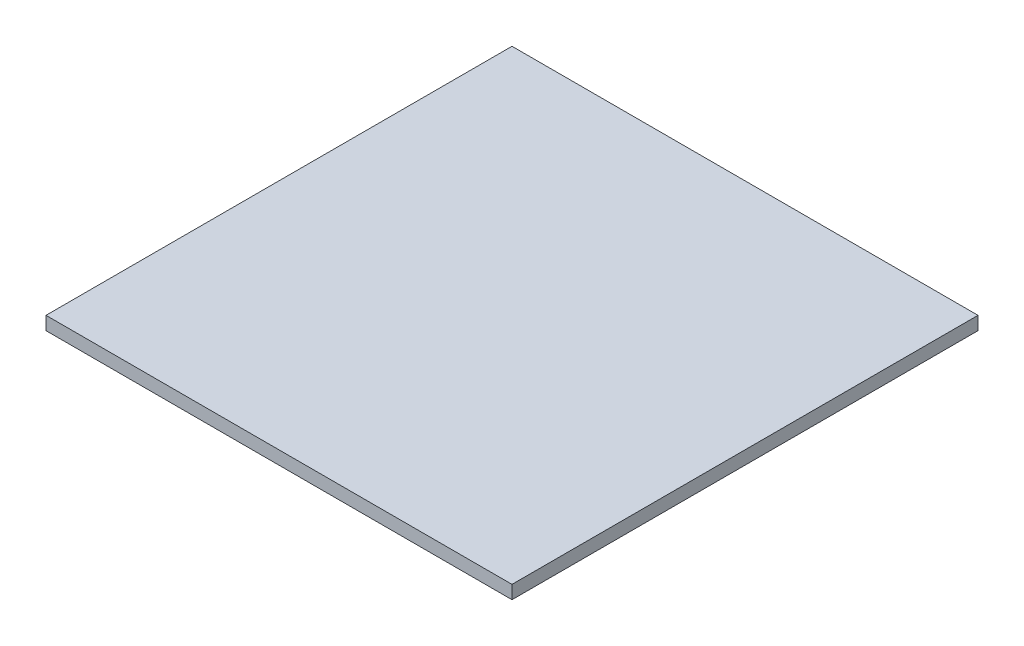
ISO-10303-21;
HEADER;
FILE_DESCRIPTION(('STEP AP214'),'2;1');
FILE_NAME('part.step','',(''),(''),'','','');
FILE_SCHEMA(('AUTOMOTIVE_DESIGN { 1 0 10303 214 1 1 1 1 }'));
ENDSEC;
DATA;
#1=APPLICATION_CONTEXT('core data for automotive mechanical design processes');
#2=APPLICATION_PROTOCOL_DEFINITION('international standard','automotive_design',2000,#1);
#3=PRODUCT_CONTEXT('',#1,'mechanical');
#4=PRODUCT('Part','Part','',(#3));
#5=PRODUCT_RELATED_PRODUCT_CATEGORY('part','',(#4));
#6=PRODUCT_DEFINITION_FORMATION('','',#4);
#7=PRODUCT_DEFINITION_CONTEXT('part definition',#1,'design');
#8=PRODUCT_DEFINITION('design','',#6,#7);
#9=PRODUCT_DEFINITION_SHAPE('','',#8);
#10=(LENGTH_UNIT() NAMED_UNIT(*) SI_UNIT(.MILLI.,.METRE.));
#11=(NAMED_UNIT(*) PLANE_ANGLE_UNIT() SI_UNIT($,.RADIAN.));
#12=(NAMED_UNIT(*) SI_UNIT($,.STERADIAN.) SOLID_ANGLE_UNIT());
#13=UNCERTAINTY_MEASURE_WITH_UNIT(LENGTH_MEASURE(1.E-05),#10,'distance_accuracy_value','');
#14=(GEOMETRIC_REPRESENTATION_CONTEXT(3) GLOBAL_UNCERTAINTY_ASSIGNED_CONTEXT((#13)) GLOBAL_UNIT_ASSIGNED_CONTEXT((#10,
#11,#12)) REPRESENTATION_CONTEXT('',''));
#15=CARTESIAN_POINT('',(0.,0.,0.));
#16=DIRECTION('',(0.,0.,1.));
#17=DIRECTION('',(1.,0.,0.));
#18=AXIS2_PLACEMENT_3D('',#15,#16,#17);
#19=CARTESIAN_POINT('',(52.5,3.,-52.5));
#20=DIRECTION('',(-1.,0.,0.));
#21=DIRECTION('',(0.,0.,1.));
#22=AXIS2_PLACEMENT_3D('',#19,#20,#21);
#23=PLANE('',#22);
#24=DIRECTION('',(0.,0.,-1.));
#25=VECTOR('',#24,1.);
#26=CARTESIAN_POINT('',(52.5,0.,-52.5));
#27=LINE('',#26,#25);
#28=CARTESIAN_POINT('',(52.5,0.,52.5));
#29=VERTEX_POINT('',#28);
#30=CARTESIAN_POINT('',(52.5,0.,-52.5));
#31=VERTEX_POINT('',#30);
#32=EDGE_CURVE('E102',#29,#31,#27,.T.);
#33=ORIENTED_EDGE('',*,*,#32,.T.);
#34=DIRECTION('',(0.,-1.,0.));
#35=VECTOR('',#34,1.);
#36=CARTESIAN_POINT('',(52.5,3.,-52.5));
#37=LINE('',#36,#35);
#38=CARTESIAN_POINT('',(52.5,3.,-52.5));
#39=VERTEX_POINT('',#38);
#40=EDGE_CURVE('E11',#39,#31,#37,.T.);
#41=ORIENTED_EDGE('',*,*,#40,.F.);
#42=DIRECTION('',(0.,0.,-1.));
#43=VECTOR('',#42,1.);
#44=CARTESIAN_POINT('',(52.5,3.,-52.5));
#45=LINE('',#44,#43);
#46=CARTESIAN_POINT('',(52.5,3.,52.5));
#47=VERTEX_POINT('',#46);
#48=EDGE_CURVE('E90',#47,#39,#45,.T.);
#49=ORIENTED_EDGE('',*,*,#48,.F.);
#50=DIRECTION('',(0.,-1.,0.));
#51=VECTOR('',#50,1.);
#52=CARTESIAN_POINT('',(52.5,3.,52.5));
#53=LINE('',#52,#51);
#54=EDGE_CURVE('E98',#47,#29,#53,.T.);
#55=ORIENTED_EDGE('',*,*,#54,.T.);
#56=EDGE_LOOP('',(#33,#41,#49,#55));
#57=FACE_BOUND('',#56,.T.);
#58=ADVANCED_FACE('F39',(#57),#23,.F.);
#59=CARTESIAN_POINT('',(-52.5,3.,-52.5));
#60=DIRECTION('',(0.,0.,1.));
#61=DIRECTION('',(1.,0.,0.));
#62=AXIS2_PLACEMENT_3D('',#59,#60,#61);
#63=PLANE('',#62);
#64=DIRECTION('',(-1.,0.,0.));
#65=VECTOR('',#64,1.);
#66=CARTESIAN_POINT('',(-52.5,0.,-52.5));
#67=LINE('',#66,#65);
#68=CARTESIAN_POINT('',(-52.5,0.,-52.5));
#69=VERTEX_POINT('',#68);
#70=EDGE_CURVE('E94',#31,#69,#67,.T.);
#71=ORIENTED_EDGE('',*,*,#70,.T.);
#72=DIRECTION('',(0.,-1.,0.));
#73=VECTOR('',#72,1.);
#74=CARTESIAN_POINT('',(-52.5,3.,-52.5));
#75=LINE('',#74,#73);
#76=CARTESIAN_POINT('',(-52.5,3.,-52.5));
#77=VERTEX_POINT('',#76);
#78=EDGE_CURVE('E47',#77,#69,#75,.T.);
#79=ORIENTED_EDGE('',*,*,#78,.F.);
#80=DIRECTION('',(-1.,0.,0.));
#81=VECTOR('',#80,1.);
#82=CARTESIAN_POINT('',(-52.5,3.,-52.5));
#83=LINE('',#82,#81);
#84=EDGE_CURVE('E85',#39,#77,#83,.T.);
#85=ORIENTED_EDGE('',*,*,#84,.F.);
#86=ORIENTED_EDGE('',*,*,#40,.T.);
#87=EDGE_LOOP('',(#71,#79,#85,#86));
#88=FACE_BOUND('',#87,.T.);
#89=ADVANCED_FACE('F93',(#88),#63,.F.);
#90=CARTESIAN_POINT('',(-52.5,3.,-52.5));
#91=DIRECTION('',(1.,0.,0.));
#92=DIRECTION('',(0.,0.,-1.));
#93=AXIS2_PLACEMENT_3D('',#90,#91,#92);
#94=PLANE('',#93);
#95=DIRECTION('',(0.,0.,1.));
#96=VECTOR('',#95,1.);
#97=CARTESIAN_POINT('',(-52.5,0.,-52.5));
#98=LINE('',#97,#96);
#99=CARTESIAN_POINT('',(-52.5,0.,52.5));
#100=VERTEX_POINT('',#99);
#101=EDGE_CURVE('E72',#69,#100,#98,.T.);
#102=ORIENTED_EDGE('',*,*,#101,.T.);
#103=DIRECTION('',(0.,-1.,0.));
#104=VECTOR('',#103,1.);
#105=CARTESIAN_POINT('',(-52.5,3.,52.5));
#106=LINE('',#105,#104);
#107=CARTESIAN_POINT('',(-52.5,3.,52.5));
#108=VERTEX_POINT('',#107);
#109=EDGE_CURVE('E95',#108,#100,#106,.T.);
#110=ORIENTED_EDGE('',*,*,#109,.F.);
#111=DIRECTION('',(0.,0.,1.));
#112=VECTOR('',#111,1.);
#113=CARTESIAN_POINT('',(-52.5,3.,-52.5));
#114=LINE('',#113,#112);
#115=EDGE_CURVE('E88',#77,#108,#114,.T.);
#116=ORIENTED_EDGE('',*,*,#115,.F.);
#117=ORIENTED_EDGE('',*,*,#78,.T.);
#118=EDGE_LOOP('',(#102,#110,#116,#117));
#119=FACE_BOUND('',#118,.T.);
#120=ADVANCED_FACE('F96',(#119),#94,.F.);
#121=CARTESIAN_POINT('',(-52.5,3.,52.5));
#122=DIRECTION('',(0.,0.,-1.));
#123=DIRECTION('',(-1.,0.,0.));
#124=AXIS2_PLACEMENT_3D('',#121,#122,#123);
#125=PLANE('',#124);
#126=DIRECTION('',(1.,0.,0.));
#127=VECTOR('',#126,1.);
#128=CARTESIAN_POINT('',(-52.5,0.,52.5));
#129=LINE('',#128,#127);
#130=EDGE_CURVE('E78',#100,#29,#129,.T.);
#131=ORIENTED_EDGE('',*,*,#130,.T.);
#132=ORIENTED_EDGE('',*,*,#54,.F.);
#133=DIRECTION('',(1.,0.,0.));
#134=VECTOR('',#133,1.);
#135=CARTESIAN_POINT('',(-52.5,3.,52.5));
#136=LINE('',#135,#134);
#137=EDGE_CURVE('E55',#108,#47,#136,.T.);
#138=ORIENTED_EDGE('',*,*,#137,.F.);
#139=ORIENTED_EDGE('',*,*,#109,.T.);
#140=EDGE_LOOP('',(#131,#132,#138,#139));
#141=FACE_BOUND('',#140,.T.);
#142=ADVANCED_FACE('F109',(#141),#125,.F.);
#143=CARTESIAN_POINT('',(0.,3.,0.));
#144=DIRECTION('',(0.,1.,0.));
#145=DIRECTION('',(0.,0.,1.));
#146=AXIS2_PLACEMENT_3D('',#143,#144,#145);
#147=PLANE('',#146);
#148=ORIENTED_EDGE('',*,*,#48,.T.);
#149=ORIENTED_EDGE('',*,*,#84,.T.);
#150=ORIENTED_EDGE('',*,*,#115,.T.);
#151=ORIENTED_EDGE('',*,*,#137,.T.);
#152=EDGE_LOOP('',(#148,#149,#150,#151));
#153=FACE_BOUND('',#152,.T.);
#154=ADVANCED_FACE('F86',(#153),#147,.T.);
#155=CARTESIAN_POINT('',(0.,0.,0.));
#156=DIRECTION('',(0.,1.,0.));
#157=DIRECTION('',(0.,0.,1.));
#158=AXIS2_PLACEMENT_3D('',#155,#156,#157);
#159=PLANE('',#158);
#160=ORIENTED_EDGE('',*,*,#32,.F.);
#161=ORIENTED_EDGE('',*,*,#130,.F.);
#162=ORIENTED_EDGE('',*,*,#101,.F.);
#163=ORIENTED_EDGE('',*,*,#70,.F.);
#164=EDGE_LOOP('',(#160,#161,#162,#163));
#165=FACE_BOUND('',#164,.T.);
#166=ADVANCED_FACE('F112',(#165),#159,.F.);
#167=CLOSED_SHELL('',(#58,#89,#120,#142,#154,#166));
#168=MANIFOLD_SOLID_BREP('B2',#167);
#169=ADVANCED_BREP_SHAPE_REPRESENTATION('',(#18,#168),#14);
#170=SHAPE_DEFINITION_REPRESENTATION(#9,#169);
ENDSEC;
END-ISO-10303-21;
